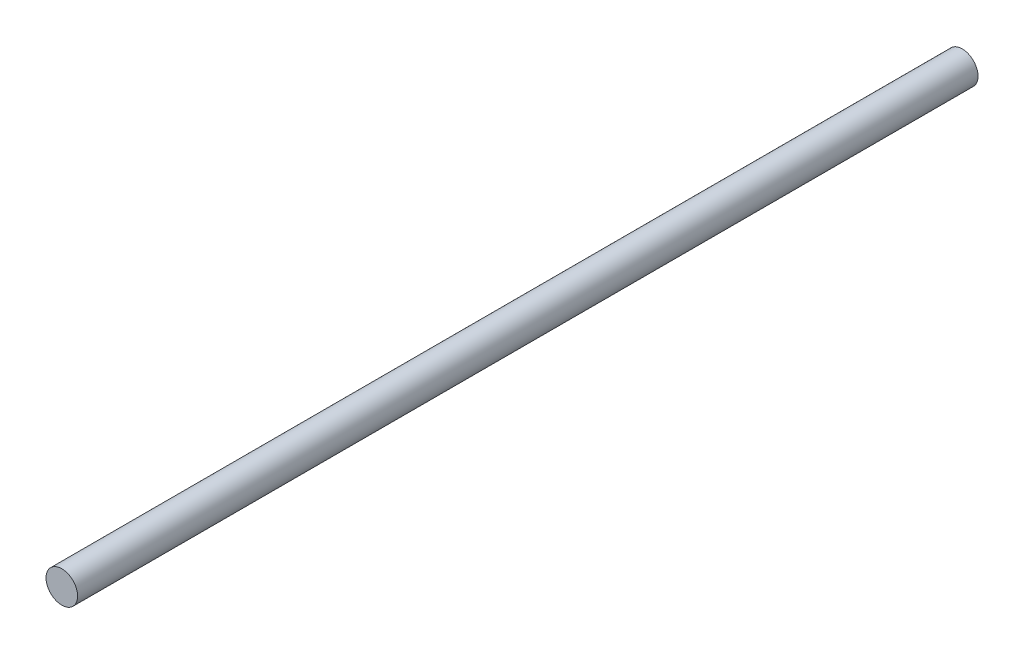
ISO-10303-21;
HEADER;
FILE_DESCRIPTION(('STEP AP214'),'2;1');
FILE_NAME('part.step','',(''),(''),'','','');
FILE_SCHEMA(('AUTOMOTIVE_DESIGN { 1 0 10303 214 1 1 1 1 }'));
ENDSEC;
DATA;
#1=APPLICATION_CONTEXT('core data for automotive mechanical design processes');
#2=APPLICATION_PROTOCOL_DEFINITION('international standard','automotive_design',2000,#1);
#3=PRODUCT_CONTEXT('',#1,'mechanical');
#4=PRODUCT('Part','Part','',(#3));
#5=PRODUCT_RELATED_PRODUCT_CATEGORY('part','',(#4));
#6=PRODUCT_DEFINITION_FORMATION('','',#4);
#7=PRODUCT_DEFINITION_CONTEXT('part definition',#1,'design');
#8=PRODUCT_DEFINITION('design','',#6,#7);
#9=PRODUCT_DEFINITION_SHAPE('','',#8);
#10=(LENGTH_UNIT() NAMED_UNIT(*) SI_UNIT(.MILLI.,.METRE.));
#11=(NAMED_UNIT(*) PLANE_ANGLE_UNIT() SI_UNIT($,.RADIAN.));
#12=(NAMED_UNIT(*) SI_UNIT($,.STERADIAN.) SOLID_ANGLE_UNIT());
#13=UNCERTAINTY_MEASURE_WITH_UNIT(LENGTH_MEASURE(1.E-05),#10,'distance_accuracy_value','');
#14=(GEOMETRIC_REPRESENTATION_CONTEXT(3) GLOBAL_UNCERTAINTY_ASSIGNED_CONTEXT((#13)) GLOBAL_UNIT_ASSIGNED_CONTEXT((#10,
#11,#12)) REPRESENTATION_CONTEXT('',''));
#15=CARTESIAN_POINT('',(0.,0.,0.));
#16=DIRECTION('',(0.,0.,1.));
#17=DIRECTION('',(1.,0.,0.));
#18=AXIS2_PLACEMENT_3D('',#15,#16,#17);
#19=CARTESIAN_POINT('',(0.,0.,57.));
#20=DIRECTION('',(0.,0.,-1.));
#21=DIRECTION('',(-1.,0.,0.));
#22=AXIS2_PLACEMENT_3D('',#19,#20,#21);
#23=CYLINDRICAL_SURFACE('',#22,2.);
#24=CARTESIAN_POINT('',(0.,0.,57.));
#25=DIRECTION('',(0.,0.,1.));
#26=DIRECTION('',(1.,0.,0.));
#27=AXIS2_PLACEMENT_3D('',#24,#25,#26);
#28=CIRCLE('',#27,2.);
#29=CARTESIAN_POINT('',(-2.,0.,57.));
#30=VERTEX_POINT('',#29);
#31=EDGE_CURVE('E10',#30,#30,#28,.T.);
#32=CARTESIAN_POINT('',(0.,0.,-57.));
#33=DIRECTION('',(0.,0.,1.));
#34=DIRECTION('',(1.,0.,0.));
#35=AXIS2_PLACEMENT_3D('',#32,#33,#34);
#36=CIRCLE('',#35,2.);
#37=CARTESIAN_POINT('',(-2.,0.,-57.));
#38=VERTEX_POINT('',#37);
#39=EDGE_CURVE('E42',#38,#38,#36,.T.);
#40=CARTESIAN_POINT('',(-2.,0.,57.));
#41=CARTESIAN_POINT('',(-2.,0.,55.8125));
#42=CARTESIAN_POINT('',(-2.,0.,54.625));
#43=CARTESIAN_POINT('',(-2.,0.,52.25));
#44=CARTESIAN_POINT('',(-2.,0.,51.0625));
#45=CARTESIAN_POINT('',(-2.,0.,48.6875));
#46=CARTESIAN_POINT('',(-2.,0.,47.5));
#47=CARTESIAN_POINT('',(-2.,0.,45.125));
#48=CARTESIAN_POINT('',(-2.,0.,43.9375));
#49=CARTESIAN_POINT('',(-2.,0.,41.5625));
#50=CARTESIAN_POINT('',(-2.,0.,40.375));
#51=CARTESIAN_POINT('',(-2.,0.,38.));
#52=CARTESIAN_POINT('',(-2.,0.,36.8125));
#53=CARTESIAN_POINT('',(-2.,0.,34.4375));
#54=CARTESIAN_POINT('',(-2.,0.,33.25));
#55=CARTESIAN_POINT('',(-2.,0.,30.875));
#56=CARTESIAN_POINT('',(-2.,0.,29.6875));
#57=CARTESIAN_POINT('',(-2.,0.,27.3125));
#58=CARTESIAN_POINT('',(-2.,0.,26.125));
#59=CARTESIAN_POINT('',(-2.,0.,23.75));
#60=CARTESIAN_POINT('',(-2.,0.,22.5625));
#61=CARTESIAN_POINT('',(-2.,0.,20.1875));
#62=CARTESIAN_POINT('',(-2.,0.,19.));
#63=CARTESIAN_POINT('',(-2.,0.,16.625));
#64=CARTESIAN_POINT('',(-2.,0.,15.4375));
#65=CARTESIAN_POINT('',(-2.,0.,13.0625));
#66=CARTESIAN_POINT('',(-2.,0.,11.875));
#67=CARTESIAN_POINT('',(-2.,0.,9.5));
#68=CARTESIAN_POINT('',(-2.,0.,8.3125));
#69=CARTESIAN_POINT('',(-2.,0.,5.9375));
#70=CARTESIAN_POINT('',(-2.,0.,4.75));
#71=CARTESIAN_POINT('',(-2.,0.,2.375));
#72=CARTESIAN_POINT('',(-2.,0.,1.1875));
#73=CARTESIAN_POINT('',(-2.,0.,-1.1875));
#74=CARTESIAN_POINT('',(-2.,0.,-2.375));
#75=CARTESIAN_POINT('',(-2.,0.,-4.75));
#76=CARTESIAN_POINT('',(-2.,0.,-5.9375));
#77=CARTESIAN_POINT('',(-2.,0.,-8.3125));
#78=CARTESIAN_POINT('',(-2.,0.,-9.5));
#79=CARTESIAN_POINT('',(-2.,0.,-11.875));
#80=CARTESIAN_POINT('',(-2.,0.,-13.0625));
#81=CARTESIAN_POINT('',(-2.,0.,-15.4375));
#82=CARTESIAN_POINT('',(-2.,0.,-16.625));
#83=CARTESIAN_POINT('',(-2.,0.,-19.));
#84=CARTESIAN_POINT('',(-2.,0.,-20.1875));
#85=CARTESIAN_POINT('',(-2.,0.,-22.5625));
#86=CARTESIAN_POINT('',(-2.,0.,-23.75));
#87=CARTESIAN_POINT('',(-2.,0.,-26.125));
#88=CARTESIAN_POINT('',(-2.,0.,-27.3125));
#89=CARTESIAN_POINT('',(-2.,0.,-29.6875));
#90=CARTESIAN_POINT('',(-2.,0.,-30.875));
#91=CARTESIAN_POINT('',(-2.,0.,-33.25));
#92=CARTESIAN_POINT('',(-2.,0.,-34.4375));
#93=CARTESIAN_POINT('',(-2.,0.,-36.8125));
#94=CARTESIAN_POINT('',(-2.,0.,-38.));
#95=CARTESIAN_POINT('',(-2.,0.,-40.375));
#96=CARTESIAN_POINT('',(-2.,0.,-41.5625));
#97=CARTESIAN_POINT('',(-2.,0.,-43.9375));
#98=CARTESIAN_POINT('',(-2.,0.,-45.125));
#99=CARTESIAN_POINT('',(-2.,0.,-47.5));
#100=CARTESIAN_POINT('',(-2.,0.,-48.6875));
#101=CARTESIAN_POINT('',(-2.,0.,-51.0625));
#102=CARTESIAN_POINT('',(-2.,0.,-52.25));
#103=CARTESIAN_POINT('',(-2.,0.,-54.625));
#104=CARTESIAN_POINT('',(-2.,0.,-55.8125));
#105=CARTESIAN_POINT('',(-2.,0.,-57.));
#106=B_SPLINE_CURVE_WITH_KNOTS('',3,(#40,#41,#42,#43,#44,#45,#46,#47,#48,#49,#50,#51,#52,#53,
#54,#55,#56,#57,#58,#59,#60,#61,#62,#63,#64,#65,#66,#67,#68,#69,#70,#71,#72,#73,#74,#75,#76,#77,
#78,#79,#80,#81,#82,#83,#84,#85,#86,#87,#88,#89,#90,#91,#92,#93,#94,#95,#96,#97,#98,#99,#100,
#101,#102,#103,#104,#105),.UNSPECIFIED.,.F.,.F.,(4,2,2,2,2,2,2,2,2,2,2,2,2,2,2,2,2,2,2,2,2,2,2,
2,2,2,2,2,2,2,2,2,4),(0.,3.5625,7.12500000000001,10.6875,14.25,17.8125,21.375,24.9375,28.5,
32.0625,35.625,39.1875,42.75,46.3125,49.875,53.4375,57.,60.5625,64.125,67.6875,71.25,74.8125,
78.375,81.9375,85.5,89.0625,92.625,96.1875,99.75,103.3125,106.875,110.4375,114.),.UNSPECIFIED.);
#107=EDGE_CURVE('BSEAM41',#30,#38,#106,.T.);
#108=ORIENTED_EDGE('',*,*,#31,.F.);
#109=ORIENTED_EDGE('',*,*,#39,.T.);
#110=ORIENTED_EDGE('',*,*,#107,.T.);
#111=ORIENTED_EDGE('',*,*,#107,.F.);
#112=EDGE_LOOP('',(#108,#110,#109,#111));
#113=FACE_BOUND('',#112,.T.);
#114=ADVANCED_FACE('F41',(#113),#23,.T.);
#115=CARTESIAN_POINT('',(0.,0.,57.));
#116=DIRECTION('',(0.,0.,1.));
#117=DIRECTION('',(1.,0.,0.));
#118=AXIS2_PLACEMENT_3D('',#115,#116,#117);
#119=PLANE('',#118);
#120=ORIENTED_EDGE('',*,*,#31,.T.);
#121=EDGE_LOOP('',(#120));
#122=FACE_BOUND('',#121,.T.);
#123=ADVANCED_FACE('F59',(#122),#119,.T.);
#124=CARTESIAN_POINT('',(0.,0.,-57.));
#125=DIRECTION('',(0.,0.,1.));
#126=DIRECTION('',(1.,0.,0.));
#127=AXIS2_PLACEMENT_3D('',#124,#125,#126);
#128=PLANE('',#127);
#129=ORIENTED_EDGE('',*,*,#39,.F.);
#130=EDGE_LOOP('',(#129));
#131=FACE_BOUND('',#130,.T.);
#132=ADVANCED_FACE('F57',(#131),#128,.F.);
#133=CLOSED_SHELL('',(#114,#123,#132));
#134=MANIFOLD_SOLID_BREP('B2',#133);
#135=ADVANCED_BREP_SHAPE_REPRESENTATION('',(#18,#134),#14);
#136=SHAPE_DEFINITION_REPRESENTATION(#9,#135);
ENDSEC;
END-ISO-10303-21;
